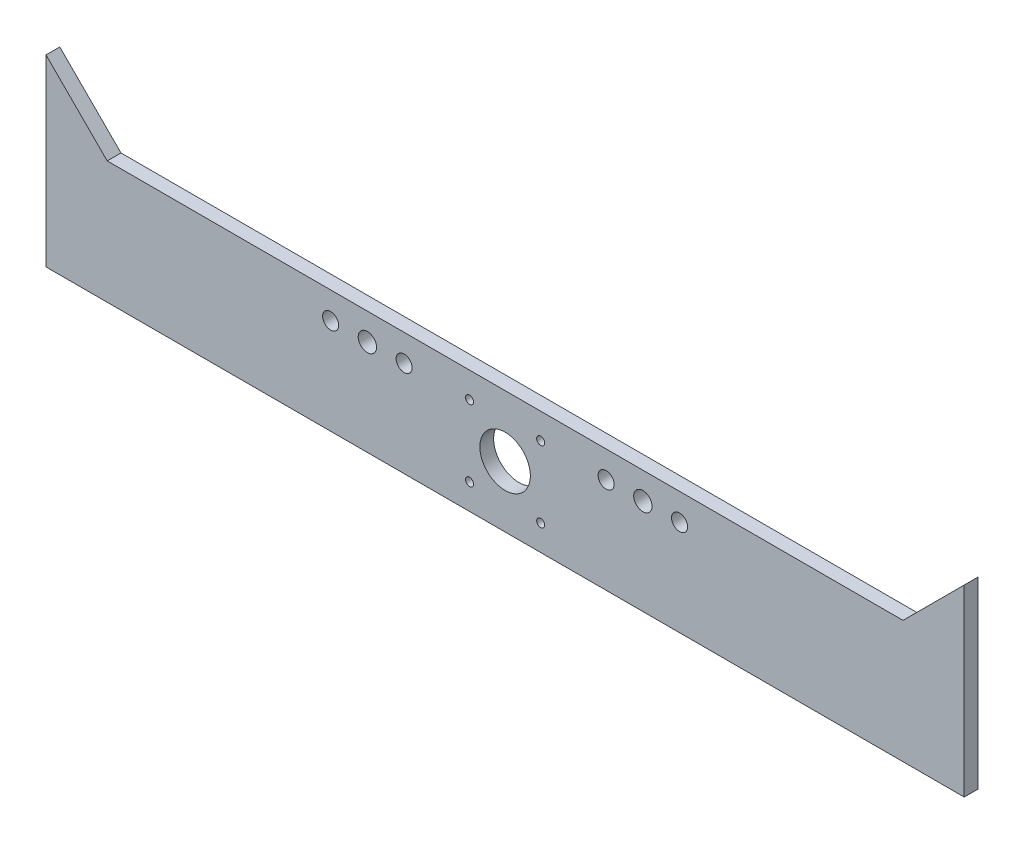
ISO-10303-21;
HEADER;
FILE_DESCRIPTION(('STEP AP214'),'2;1');
FILE_NAME('part.step','',(''),(''),'','','');
FILE_SCHEMA(('AUTOMOTIVE_DESIGN { 1 0 10303 214 1 1 1 1 }'));
ENDSEC;
DATA;
#1=APPLICATION_CONTEXT('core data for automotive mechanical design processes');
#2=APPLICATION_PROTOCOL_DEFINITION('international standard','automotive_design',2000,#1);
#3=PRODUCT_CONTEXT('',#1,'mechanical');
#4=PRODUCT('Part','Part','',(#3));
#5=PRODUCT_RELATED_PRODUCT_CATEGORY('part','',(#4));
#6=PRODUCT_DEFINITION_FORMATION('','',#4);
#7=PRODUCT_DEFINITION_CONTEXT('part definition',#1,'design');
#8=PRODUCT_DEFINITION('design','',#6,#7);
#9=PRODUCT_DEFINITION_SHAPE('','',#8);
#10=(LENGTH_UNIT() NAMED_UNIT(*) SI_UNIT(.MILLI.,.METRE.));
#11=(NAMED_UNIT(*) PLANE_ANGLE_UNIT() SI_UNIT($,.RADIAN.));
#12=(NAMED_UNIT(*) SI_UNIT($,.STERADIAN.) SOLID_ANGLE_UNIT());
#13=UNCERTAINTY_MEASURE_WITH_UNIT(LENGTH_MEASURE(1.E-05),#10,'distance_accuracy_value','');
#14=(GEOMETRIC_REPRESENTATION_CONTEXT(3) GLOBAL_UNCERTAINTY_ASSIGNED_CONTEXT((#13)) GLOBAL_UNIT_ASSIGNED_CONTEXT((#10,
#11,#12)) REPRESENTATION_CONTEXT('',''));
#15=CARTESIAN_POINT('',(0.,0.,0.));
#16=DIRECTION('',(0.,0.,1.));
#17=DIRECTION('',(1.,0.,0.));
#18=AXIS2_PLACEMENT_3D('',#15,#16,#17);
#19=CARTESIAN_POINT('',(-200.,0.,6.));
#20=DIRECTION('',(1.,0.,0.));
#21=DIRECTION('',(0.,1.,0.));
#22=AXIS2_PLACEMENT_3D('',#19,#20,#21);
#23=PLANE('',#22);
#24=DIRECTION('',(0.,-1.,0.));
#25=VECTOR('',#24,1.);
#26=CARTESIAN_POINT('',(-200.,0.,0.));
#27=LINE('',#26,#25);
#28=CARTESIAN_POINT('',(-200.,80.,0.));
#29=VERTEX_POINT('',#28);
#30=CARTESIAN_POINT('',(-200.,0.,0.));
#31=VERTEX_POINT('',#30);
#32=EDGE_CURVE('E117',#29,#31,#27,.T.);
#33=ORIENTED_EDGE('',*,*,#32,.T.);
#34=DIRECTION('',(0.,0.,-1.));
#35=VECTOR('',#34,1.);
#36=CARTESIAN_POINT('',(-200.,0.,6.));
#37=LINE('',#36,#35);
#38=CARTESIAN_POINT('',(-200.,0.,6.));
#39=VERTEX_POINT('',#38);
#40=EDGE_CURVE('E11',#39,#31,#37,.T.);
#41=ORIENTED_EDGE('',*,*,#40,.F.);
#42=DIRECTION('',(0.,-1.,0.));
#43=VECTOR('',#42,1.);
#44=CARTESIAN_POINT('',(-200.,0.,6.));
#45=LINE('',#44,#43);
#46=CARTESIAN_POINT('',(-200.,80.,6.));
#47=VERTEX_POINT('',#46);
#48=EDGE_CURVE('E128',#47,#39,#45,.T.);
#49=ORIENTED_EDGE('',*,*,#48,.F.);
#50=DIRECTION('',(0.,0.,-1.));
#51=VECTOR('',#50,1.);
#52=CARTESIAN_POINT('',(-200.,80.,6.));
#53=LINE('',#52,#51);
#54=EDGE_CURVE('E113',#47,#29,#53,.T.);
#55=ORIENTED_EDGE('',*,*,#54,.T.);
#56=EDGE_LOOP('',(#33,#41,#49,#55));
#57=FACE_BOUND('',#56,.T.);
#58=ADVANCED_FACE('F33',(#57),#23,.F.);
#59=CARTESIAN_POINT('',(-200.,0.,6.));
#60=DIRECTION('',(0.,1.,0.));
#61=DIRECTION('',(-1.,0.,0.));
#62=AXIS2_PLACEMENT_3D('',#59,#60,#61);
#63=PLANE('',#62);
#64=DIRECTION('',(1.,0.,0.));
#65=VECTOR('',#64,1.);
#66=CARTESIAN_POINT('',(-200.,0.,0.));
#67=LINE('',#66,#65);
#68=CARTESIAN_POINT('',(200.,0.,0.));
#69=VERTEX_POINT('',#68);
#70=EDGE_CURVE('E120',#31,#69,#67,.T.);
#71=ORIENTED_EDGE('',*,*,#70,.T.);
#72=DIRECTION('',(0.,0.,-1.));
#73=VECTOR('',#72,1.);
#74=CARTESIAN_POINT('',(200.,0.,6.));
#75=LINE('',#74,#73);
#76=CARTESIAN_POINT('',(200.,0.,6.));
#77=VERTEX_POINT('',#76);
#78=EDGE_CURVE('E41',#77,#69,#75,.T.);
#79=ORIENTED_EDGE('',*,*,#78,.F.);
#80=DIRECTION('',(1.,0.,0.));
#81=VECTOR('',#80,1.);
#82=CARTESIAN_POINT('',(-200.,0.,6.));
#83=LINE('',#82,#81);
#84=EDGE_CURVE('E86',#39,#77,#83,.T.);
#85=ORIENTED_EDGE('',*,*,#84,.F.);
#86=ORIENTED_EDGE('',*,*,#40,.T.);
#87=EDGE_LOOP('',(#71,#79,#85,#86));
#88=FACE_BOUND('',#87,.T.);
#89=ADVANCED_FACE('F153',(#88),#63,.F.);
#90=CARTESIAN_POINT('',(200.,0.,6.));
#91=DIRECTION('',(-1.,0.,0.));
#92=DIRECTION('',(0.,0.,1.));
#93=AXIS2_PLACEMENT_3D('',#90,#91,#92);
#94=PLANE('',#93);
#95=DIRECTION('',(0.,1.,0.));
#96=VECTOR('',#95,1.);
#97=CARTESIAN_POINT('',(200.,0.,0.));
#98=LINE('',#97,#96);
#99=CARTESIAN_POINT('',(200.,80.0000000000001,0.));
#100=VERTEX_POINT('',#99);
#101=EDGE_CURVE('E123',#69,#100,#98,.T.);
#102=ORIENTED_EDGE('',*,*,#101,.T.);
#103=DIRECTION('',(0.,0.,-1.));
#104=VECTOR('',#103,1.);
#105=CARTESIAN_POINT('',(200.,80.0000000000001,6.));
#106=LINE('',#105,#104);
#107=CARTESIAN_POINT('',(200.,80.0000000000001,6.));
#108=VERTEX_POINT('',#107);
#109=EDGE_CURVE('E108',#108,#100,#106,.T.);
#110=ORIENTED_EDGE('',*,*,#109,.F.);
#111=DIRECTION('',(0.,1.,0.));
#112=VECTOR('',#111,1.);
#113=CARTESIAN_POINT('',(200.,0.,6.));
#114=LINE('',#113,#112);
#115=EDGE_CURVE('E99',#77,#108,#114,.T.);
#116=ORIENTED_EDGE('',*,*,#115,.F.);
#117=ORIENTED_EDGE('',*,*,#78,.T.);
#118=EDGE_LOOP('',(#102,#110,#116,#117));
#119=FACE_BOUND('',#118,.T.);
#120=ADVANCED_FACE('F134',(#119),#94,.F.);
#121=CARTESIAN_POINT('',(200.,80.0000000000001,6.));
#122=DIRECTION('',(0.707106781186552,-0.707106781186543,0.));
#123=DIRECTION('',(0.707106781186543,0.707106781186552,0.));
#124=AXIS2_PLACEMENT_3D('',#121,#122,#123);
#125=PLANE('',#124);
#126=DIRECTION('',(-0.707106781186543,-0.707106781186552,0.));
#127=VECTOR('',#126,1.);
#128=CARTESIAN_POINT('',(200.,80.0000000000001,0.));
#129=LINE('',#128,#127);
#130=CARTESIAN_POINT('',(173.333333333334,53.3333333333334,0.));
#131=VERTEX_POINT('',#130);
#132=EDGE_CURVE('E107',#100,#131,#129,.T.);
#133=ORIENTED_EDGE('',*,*,#132,.T.);
#134=DIRECTION('',(0.,0.,-1.));
#135=VECTOR('',#134,1.);
#136=CARTESIAN_POINT('',(173.333333333334,53.3333333333334,6.));
#137=LINE('',#136,#135);
#138=CARTESIAN_POINT('',(173.333333333334,53.3333333333334,6.));
#139=VERTEX_POINT('',#138);
#140=EDGE_CURVE('E104',#139,#131,#137,.T.);
#141=ORIENTED_EDGE('',*,*,#140,.F.);
#142=DIRECTION('',(-0.707106781186543,-0.707106781186552,0.));
#143=VECTOR('',#142,1.);
#144=CARTESIAN_POINT('',(200.,80.0000000000001,6.));
#145=LINE('',#144,#143);
#146=EDGE_CURVE('E93',#108,#139,#145,.T.);
#147=ORIENTED_EDGE('',*,*,#146,.F.);
#148=ORIENTED_EDGE('',*,*,#109,.T.);
#149=EDGE_LOOP('',(#133,#141,#147,#148));
#150=FACE_BOUND('',#149,.T.);
#151=ADVANCED_FACE('F105',(#150),#125,.F.);
#152=CARTESIAN_POINT('',(-173.333333333334,53.333333333332,6.));
#153=DIRECTION('',(0.,-1.,0.));
#154=DIRECTION('',(1.,0.,0.));
#155=AXIS2_PLACEMENT_3D('',#152,#153,#154);
#156=PLANE('',#155);
#157=DIRECTION('',(-1.,0.,0.));
#158=VECTOR('',#157,1.);
#159=CARTESIAN_POINT('',(-173.333333333334,53.333333333332,0.));
#160=LINE('',#159,#158);
#161=CARTESIAN_POINT('',(-173.333333333334,53.333333333332,0.));
#162=VERTEX_POINT('',#161);
#163=EDGE_CURVE('E72',#131,#162,#160,.T.);
#164=ORIENTED_EDGE('',*,*,#163,.T.);
#165=DIRECTION('',(0.,0.,-1.));
#166=VECTOR('',#165,1.);
#167=CARTESIAN_POINT('',(-173.333333333334,53.333333333332,6.));
#168=LINE('',#167,#166);
#169=CARTESIAN_POINT('',(-173.333333333334,53.333333333332,6.));
#170=VERTEX_POINT('',#169);
#171=EDGE_CURVE('E109',#170,#162,#168,.T.);
#172=ORIENTED_EDGE('',*,*,#171,.F.);
#173=DIRECTION('',(-1.,0.,0.));
#174=VECTOR('',#173,1.);
#175=CARTESIAN_POINT('',(-173.333333333334,53.333333333332,6.));
#176=LINE('',#175,#174);
#177=EDGE_CURVE('E97',#139,#170,#176,.T.);
#178=ORIENTED_EDGE('',*,*,#177,.F.);
#179=ORIENTED_EDGE('',*,*,#140,.T.);
#180=EDGE_LOOP('',(#164,#172,#178,#179));
#181=FACE_BOUND('',#180,.T.);
#182=ADVANCED_FACE('F111',(#181),#156,.F.);
#183=CARTESIAN_POINT('',(-200.,80.,6.));
#184=DIRECTION('',(-0.707106781186573,-0.707106781186522,0.));
#185=DIRECTION('',(0.707106781186522,-0.707106781186573,0.));
#186=AXIS2_PLACEMENT_3D('',#183,#184,#185);
#187=PLANE('',#186);
#188=DIRECTION('',(-0.707106781186522,0.707106781186573,0.));
#189=VECTOR('',#188,1.);
#190=CARTESIAN_POINT('',(-200.,80.,0.));
#191=LINE('',#190,#189);
#192=EDGE_CURVE('E78',#162,#29,#191,.T.);
#193=ORIENTED_EDGE('',*,*,#192,.T.);
#194=ORIENTED_EDGE('',*,*,#54,.F.);
#195=DIRECTION('',(-0.707106781186522,0.707106781186573,0.));
#196=VECTOR('',#195,1.);
#197=CARTESIAN_POINT('',(-200.,80.,6.));
#198=LINE('',#197,#196);
#199=EDGE_CURVE('E49',#170,#47,#198,.T.);
#200=ORIENTED_EDGE('',*,*,#199,.F.);
#201=ORIENTED_EDGE('',*,*,#171,.T.);
#202=EDGE_LOOP('',(#193,#194,#200,#201));
#203=FACE_BOUND('',#202,.T.);
#204=ADVANCED_FACE('F141',(#203),#187,.F.);
#205=CARTESIAN_POINT('',(0.,0.,6.));
#206=DIRECTION('',(0.,0.,-1.));
#207=DIRECTION('',(-1.,0.,0.));
#208=AXIS2_PLACEMENT_3D('',#205,#206,#207);
#209=PLANE('',#208);
#210=CARTESIAN_POINT('',(-60.0000000000003,41.6649999999996,6.));
#211=DIRECTION('',(0.,0.,1.));
#212=DIRECTION('',(-1.,0.,0.));
#213=AXIS2_PLACEMENT_3D('',#210,#211,#212);
#214=CIRCLE('',#213,3.99999999999999);
#215=CARTESIAN_POINT('',(-64.0000000000003,41.6649999999996,6.));
#216=VERTEX_POINT('',#215);
#217=EDGE_CURVE('E309',#216,#216,#214,.T.);
#218=ORIENTED_EDGE('',*,*,#217,.F.);
#219=EDGE_LOOP('',(#218));
#220=FACE_BOUND('',#219,.T.);
#221=CARTESIAN_POINT('',(-76.0000000000003,41.6649999999996,6.));
#222=DIRECTION('',(0.,0.,1.));
#223=DIRECTION('',(-1.,0.,0.));
#224=AXIS2_PLACEMENT_3D('',#221,#222,#223);
#225=CIRCLE('',#224,3.50000000000001);
#226=CARTESIAN_POINT('',(-79.5000000000003,41.6649999999996,6.));
#227=VERTEX_POINT('',#226);
#228=EDGE_CURVE('E311',#227,#227,#225,.T.);
#229=ORIENTED_EDGE('',*,*,#228,.F.);
#230=EDGE_LOOP('',(#229));
#231=FACE_BOUND('',#230,.T.);
#232=CARTESIAN_POINT('',(15.5,42.165,6.));
#233=DIRECTION('',(0.,0.,1.));
#234=DIRECTION('',(1.,0.,0.));
#235=AXIS2_PLACEMENT_3D('',#232,#233,#234);
#236=CIRCLE('',#235,1.75);
#237=CARTESIAN_POINT('',(17.25,42.165,6.));
#238=VERTEX_POINT('',#237);
#239=EDGE_CURVE('E325',#238,#238,#236,.T.);
#240=ORIENTED_EDGE('',*,*,#239,.F.);
#241=EDGE_LOOP('',(#240));
#242=FACE_BOUND('',#241,.T.);
#243=CARTESIAN_POINT('',(-15.5000000000003,42.165,6.));
#244=DIRECTION('',(0.,0.,1.));
#245=DIRECTION('',(-1.,0.,0.));
#246=AXIS2_PLACEMENT_3D('',#243,#244,#245);
#247=CIRCLE('',#246,1.75);
#248=CARTESIAN_POINT('',(-17.2500000000003,42.165,6.));
#249=VERTEX_POINT('',#248);
#250=EDGE_CURVE('E338',#249,#249,#247,.T.);
#251=ORIENTED_EDGE('',*,*,#250,.F.);
#252=EDGE_LOOP('',(#251));
#253=FACE_BOUND('',#252,.T.);
#254=CARTESIAN_POINT('',(-15.5000000000003,11.165,6.));
#255=DIRECTION('',(0.,0.,1.));
#256=DIRECTION('',(1.,0.,0.));
#257=AXIS2_PLACEMENT_3D('',#254,#255,#256);
#258=CIRCLE('',#257,1.75);
#259=CARTESIAN_POINT('',(-13.7500000000003,11.165,6.));
#260=VERTEX_POINT('',#259);
#261=EDGE_CURVE('E344',#260,#260,#258,.T.);
#262=ORIENTED_EDGE('',*,*,#261,.F.);
#263=EDGE_LOOP('',(#262));
#264=FACE_BOUND('',#263,.T.);
#265=CARTESIAN_POINT('',(15.5,11.165,6.));
#266=DIRECTION('',(0.,0.,1.));
#267=DIRECTION('',(-1.,0.,0.));
#268=AXIS2_PLACEMENT_3D('',#265,#266,#267);
#269=CIRCLE('',#268,1.75);
#270=CARTESIAN_POINT('',(13.75,11.165,6.));
#271=VERTEX_POINT('',#270);
#272=EDGE_CURVE('E350',#271,#271,#269,.T.);
#273=ORIENTED_EDGE('',*,*,#272,.F.);
#274=EDGE_LOOP('',(#273));
#275=FACE_BOUND('',#274,.T.);
#276=CARTESIAN_POINT('',(60.,41.6650000000001,6.));
#277=DIRECTION('',(0.,0.,1.));
#278=DIRECTION('',(1.,0.,0.));
#279=AXIS2_PLACEMENT_3D('',#276,#277,#278);
#280=CIRCLE('',#279,4.00000000000001);
#281=CARTESIAN_POINT('',(64.,41.6650000000001,6.));
#282=VERTEX_POINT('',#281);
#283=EDGE_CURVE('E372',#282,#282,#280,.T.);
#284=ORIENTED_EDGE('',*,*,#283,.F.);
#285=EDGE_LOOP('',(#284));
#286=FACE_BOUND('',#285,.T.);
#287=CARTESIAN_POINT('',(76.0000000000001,41.665,6.));
#288=DIRECTION('',(0.,0.,1.));
#289=DIRECTION('',(1.,0.,0.));
#290=AXIS2_PLACEMENT_3D('',#287,#288,#289);
#291=CIRCLE('',#290,3.50000000000001);
#292=CARTESIAN_POINT('',(79.5000000000001,41.665,6.));
#293=VERTEX_POINT('',#292);
#294=EDGE_CURVE('E376',#293,#293,#291,.T.);
#295=ORIENTED_EDGE('',*,*,#294,.F.);
#296=EDGE_LOOP('',(#295));
#297=FACE_BOUND('',#296,.T.);
#298=CARTESIAN_POINT('',(44.,41.665,6.));
#299=DIRECTION('',(0.,0.,1.));
#300=DIRECTION('',(1.,0.,0.));
#301=AXIS2_PLACEMENT_3D('',#298,#299,#300);
#302=CIRCLE('',#301,3.5);
#303=CARTESIAN_POINT('',(47.5000000000001,41.665,6.));
#304=VERTEX_POINT('',#303);
#305=EDGE_CURVE('E380',#304,#304,#302,.T.);
#306=ORIENTED_EDGE('',*,*,#305,.F.);
#307=EDGE_LOOP('',(#306));
#308=FACE_BOUND('',#307,.T.);
#309=CARTESIAN_POINT('',(-44.0000000000003,41.6649999999996,6.));
#310=DIRECTION('',(0.,0.,1.));
#311=DIRECTION('',(-1.,0.,0.));
#312=AXIS2_PLACEMENT_3D('',#309,#310,#311);
#313=CIRCLE('',#312,3.50000000000001);
#314=CARTESIAN_POINT('',(-47.5000000000004,41.6649999999996,6.));
#315=VERTEX_POINT('',#314);
#316=EDGE_CURVE('E333',#315,#315,#313,.T.);
#317=ORIENTED_EDGE('',*,*,#316,.F.);
#318=EDGE_LOOP('',(#317));
#319=FACE_BOUND('',#318,.T.);
#320=CARTESIAN_POINT('',(0.,26.6649999999999,6.));
#321=DIRECTION('',(0.,0.,1.));
#322=DIRECTION('',(1.,0.,0.));
#323=AXIS2_PLACEMENT_3D('',#320,#321,#322);
#324=CIRCLE('',#323,11.);
#325=CARTESIAN_POINT('',(11.,26.6649999999999,6.));
#326=VERTEX_POINT('',#325);
#327=EDGE_CURVE('E317',#326,#326,#324,.T.);
#328=ORIENTED_EDGE('',*,*,#327,.F.);
#329=EDGE_LOOP('',(#328));
#330=FACE_BOUND('',#329,.T.);
#331=ORIENTED_EDGE('',*,*,#48,.T.);
#332=ORIENTED_EDGE('',*,*,#84,.T.);
#333=ORIENTED_EDGE('',*,*,#115,.T.);
#334=ORIENTED_EDGE('',*,*,#146,.T.);
#335=ORIENTED_EDGE('',*,*,#177,.T.);
#336=ORIENTED_EDGE('',*,*,#199,.T.);
#337=EDGE_LOOP('',(#331,#332,#333,#334,#335,#336));
#338=FACE_BOUND('',#337,.T.);
#339=ADVANCED_FACE('F95',(#220,#231,#242,#253,#264,#275,#286,#297,#308,#319,#330,#338),#209,.F.);
#340=CARTESIAN_POINT('',(0.,0.,0.));
#341=DIRECTION('',(0.,0.,-1.));
#342=DIRECTION('',(-1.,0.,0.));
#343=AXIS2_PLACEMENT_3D('',#340,#341,#342);
#344=PLANE('',#343);
#345=CARTESIAN_POINT('',(-60.0000000000003,41.6649999999996,0.));
#346=DIRECTION('',(0.,0.,1.));
#347=DIRECTION('',(-1.,0.,0.));
#348=AXIS2_PLACEMENT_3D('',#345,#346,#347);
#349=CIRCLE('',#348,3.99999999999999);
#350=CARTESIAN_POINT('',(-64.0000000000003,41.6649999999996,0.));
#351=VERTEX_POINT('',#350);
#352=EDGE_CURVE('E306',#351,#351,#349,.T.);
#353=ORIENTED_EDGE('',*,*,#352,.T.);
#354=EDGE_LOOP('',(#353));
#355=FACE_BOUND('',#354,.T.);
#356=CARTESIAN_POINT('',(-76.0000000000003,41.6649999999996,0.));
#357=DIRECTION('',(0.,0.,1.));
#358=DIRECTION('',(-1.,0.,0.));
#359=AXIS2_PLACEMENT_3D('',#356,#357,#358);
#360=CIRCLE('',#359,3.50000000000001);
#361=CARTESIAN_POINT('',(-79.5000000000003,41.6649999999996,0.));
#362=VERTEX_POINT('',#361);
#363=EDGE_CURVE('E354',#362,#362,#360,.T.);
#364=ORIENTED_EDGE('',*,*,#363,.T.);
#365=EDGE_LOOP('',(#364));
#366=FACE_BOUND('',#365,.T.);
#367=CARTESIAN_POINT('',(15.5,42.165,0.));
#368=DIRECTION('',(0.,0.,1.));
#369=DIRECTION('',(1.,0.,0.));
#370=AXIS2_PLACEMENT_3D('',#367,#368,#369);
#371=CIRCLE('',#370,1.75);
#372=CARTESIAN_POINT('',(17.25,42.165,0.));
#373=VERTEX_POINT('',#372);
#374=EDGE_CURVE('E320',#373,#373,#371,.T.);
#375=ORIENTED_EDGE('',*,*,#374,.T.);
#376=EDGE_LOOP('',(#375));
#377=FACE_BOUND('',#376,.T.);
#378=CARTESIAN_POINT('',(-15.5000000000003,42.165,0.));
#379=DIRECTION('',(0.,0.,1.));
#380=DIRECTION('',(-1.,0.,0.));
#381=AXIS2_PLACEMENT_3D('',#378,#379,#380);
#382=CIRCLE('',#381,1.75);
#383=CARTESIAN_POINT('',(-17.2500000000003,42.165,0.));
#384=VERTEX_POINT('',#383);
#385=EDGE_CURVE('E330',#384,#384,#382,.T.);
#386=ORIENTED_EDGE('',*,*,#385,.T.);
#387=EDGE_LOOP('',(#386));
#388=FACE_BOUND('',#387,.T.);
#389=CARTESIAN_POINT('',(-15.5000000000003,11.165,0.));
#390=DIRECTION('',(0.,0.,1.));
#391=DIRECTION('',(1.,0.,0.));
#392=AXIS2_PLACEMENT_3D('',#389,#390,#391);
#393=CIRCLE('',#392,1.75);
#394=CARTESIAN_POINT('',(-13.7500000000003,11.165,0.));
#395=VERTEX_POINT('',#394);
#396=EDGE_CURVE('E341',#395,#395,#393,.T.);
#397=ORIENTED_EDGE('',*,*,#396,.T.);
#398=EDGE_LOOP('',(#397));
#399=FACE_BOUND('',#398,.T.);
#400=CARTESIAN_POINT('',(15.5,11.165,0.));
#401=DIRECTION('',(0.,0.,1.));
#402=DIRECTION('',(-1.,0.,0.));
#403=AXIS2_PLACEMENT_3D('',#400,#401,#402);
#404=CIRCLE('',#403,1.75);
#405=CARTESIAN_POINT('',(13.75,11.165,0.));
#406=VERTEX_POINT('',#405);
#407=EDGE_CURVE('E347',#406,#406,#404,.T.);
#408=ORIENTED_EDGE('',*,*,#407,.T.);
#409=EDGE_LOOP('',(#408));
#410=FACE_BOUND('',#409,.T.);
#411=CARTESIAN_POINT('',(60.,41.6650000000001,0.));
#412=DIRECTION('',(0.,0.,1.));
#413=DIRECTION('',(1.,0.,0.));
#414=AXIS2_PLACEMENT_3D('',#411,#412,#413);
#415=CIRCLE('',#414,4.00000000000001);
#416=CARTESIAN_POINT('',(64.,41.6650000000001,0.));
#417=VERTEX_POINT('',#416);
#418=EDGE_CURVE('E353',#417,#417,#415,.T.);
#419=ORIENTED_EDGE('',*,*,#418,.T.);
#420=EDGE_LOOP('',(#419));
#421=FACE_BOUND('',#420,.T.);
#422=CARTESIAN_POINT('',(76.0000000000001,41.665,0.));
#423=DIRECTION('',(0.,0.,1.));
#424=DIRECTION('',(1.,0.,0.));
#425=AXIS2_PLACEMENT_3D('',#422,#423,#424);
#426=CIRCLE('',#425,3.50000000000001);
#427=CARTESIAN_POINT('',(79.5000000000001,41.665,0.));
#428=VERTEX_POINT('',#427);
#429=EDGE_CURVE('E395',#428,#428,#426,.T.);
#430=ORIENTED_EDGE('',*,*,#429,.T.);
#431=EDGE_LOOP('',(#430));
#432=FACE_BOUND('',#431,.T.);
#433=CARTESIAN_POINT('',(44.,41.665,0.));
#434=DIRECTION('',(0.,0.,1.));
#435=DIRECTION('',(1.,0.,0.));
#436=AXIS2_PLACEMENT_3D('',#433,#434,#435);
#437=CIRCLE('',#436,3.5);
#438=CARTESIAN_POINT('',(47.5000000000001,41.665,0.));
#439=VERTEX_POINT('',#438);
#440=EDGE_CURVE('E389',#439,#439,#437,.T.);
#441=ORIENTED_EDGE('',*,*,#440,.T.);
#442=EDGE_LOOP('',(#441));
#443=FACE_BOUND('',#442,.T.);
#444=CARTESIAN_POINT('',(-44.0000000000003,41.6649999999996,0.));
#445=DIRECTION('',(0.,0.,1.));
#446=DIRECTION('',(-1.,0.,0.));
#447=AXIS2_PLACEMENT_3D('',#444,#445,#446);
#448=CIRCLE('',#447,3.50000000000001);
#449=CARTESIAN_POINT('',(-47.5000000000004,41.6649999999996,0.));
#450=VERTEX_POINT('',#449);
#451=EDGE_CURVE('E385',#450,#450,#448,.T.);
#452=ORIENTED_EDGE('',*,*,#451,.T.);
#453=EDGE_LOOP('',(#452));
#454=FACE_BOUND('',#453,.T.);
#455=CARTESIAN_POINT('',(0.,26.6649999999999,0.));
#456=DIRECTION('',(0.,0.,1.));
#457=DIRECTION('',(1.,0.,0.));
#458=AXIS2_PLACEMENT_3D('',#455,#456,#457);
#459=CIRCLE('',#458,11.);
#460=CARTESIAN_POINT('',(11.,26.6649999999999,0.));
#461=VERTEX_POINT('',#460);
#462=EDGE_CURVE('E121',#461,#461,#459,.T.);
#463=ORIENTED_EDGE('',*,*,#462,.T.);
#464=EDGE_LOOP('',(#463));
#465=FACE_BOUND('',#464,.T.);
#466=ORIENTED_EDGE('',*,*,#32,.F.);
#467=ORIENTED_EDGE('',*,*,#192,.F.);
#468=ORIENTED_EDGE('',*,*,#163,.F.);
#469=ORIENTED_EDGE('',*,*,#132,.F.);
#470=ORIENTED_EDGE('',*,*,#101,.F.);
#471=ORIENTED_EDGE('',*,*,#70,.F.);
#472=EDGE_LOOP('',(#466,#467,#468,#469,#470,#471));
#473=FACE_BOUND('',#472,.T.);
#474=ADVANCED_FACE('F137',(#355,#366,#377,#388,#399,#410,#421,#432,#443,#454,#465,#473),#344,.T.);
#475=CARTESIAN_POINT('',(0.,26.6649999999999,0.));
#476=DIRECTION('',(0.,0.,1.));
#477=DIRECTION('',(1.,0.,0.));
#478=AXIS2_PLACEMENT_3D('',#475,#476,#477);
#479=CYLINDRICAL_SURFACE('',#478,11.);
#480=ORIENTED_EDGE('',*,*,#462,.F.);
#481=EDGE_LOOP('',(#480));
#482=FACE_BOUND('',#481,.T.);
#483=ORIENTED_EDGE('',*,*,#327,.T.);
#484=EDGE_LOOP('',(#483));
#485=FACE_BOUND('',#484,.T.);
#486=ADVANCED_FACE('F190',(#482,#485),#479,.F.);
#487=CARTESIAN_POINT('',(-44.0000000000003,41.6649999999996,0.));
#488=DIRECTION('',(0.,0.,1.));
#489=DIRECTION('',(1.,0.,0.));
#490=AXIS2_PLACEMENT_3D('',#487,#488,#489);
#491=CYLINDRICAL_SURFACE('',#490,3.50000000000001);
#492=ORIENTED_EDGE('',*,*,#451,.F.);
#493=EDGE_LOOP('',(#492));
#494=FACE_BOUND('',#493,.T.);
#495=ORIENTED_EDGE('',*,*,#316,.T.);
#496=EDGE_LOOP('',(#495));
#497=FACE_BOUND('',#496,.T.);
#498=ADVANCED_FACE('F199',(#494,#497),#491,.F.);
#499=CARTESIAN_POINT('',(44.,41.665,0.));
#500=DIRECTION('',(0.,0.,1.));
#501=DIRECTION('',(1.,0.,0.));
#502=AXIS2_PLACEMENT_3D('',#499,#500,#501);
#503=CYLINDRICAL_SURFACE('',#502,3.5);
#504=ORIENTED_EDGE('',*,*,#440,.F.);
#505=EDGE_LOOP('',(#504));
#506=FACE_BOUND('',#505,.T.);
#507=ORIENTED_EDGE('',*,*,#305,.T.);
#508=EDGE_LOOP('',(#507));
#509=FACE_BOUND('',#508,.T.);
#510=ADVANCED_FACE('F209',(#506,#509),#503,.F.);
#511=CARTESIAN_POINT('',(76.0000000000001,41.665,0.));
#512=DIRECTION('',(0.,0.,1.));
#513=DIRECTION('',(1.,0.,0.));
#514=AXIS2_PLACEMENT_3D('',#511,#512,#513);
#515=CYLINDRICAL_SURFACE('',#514,3.50000000000001);
#516=ORIENTED_EDGE('',*,*,#429,.F.);
#517=EDGE_LOOP('',(#516));
#518=FACE_BOUND('',#517,.T.);
#519=ORIENTED_EDGE('',*,*,#294,.T.);
#520=EDGE_LOOP('',(#519));
#521=FACE_BOUND('',#520,.T.);
#522=ADVANCED_FACE('F219',(#518,#521),#515,.F.);
#523=CARTESIAN_POINT('',(60.,41.6650000000001,0.));
#524=DIRECTION('',(0.,0.,1.));
#525=DIRECTION('',(1.,0.,0.));
#526=AXIS2_PLACEMENT_3D('',#523,#524,#525);
#527=CYLINDRICAL_SURFACE('',#526,4.00000000000001);
#528=ORIENTED_EDGE('',*,*,#418,.F.);
#529=EDGE_LOOP('',(#528));
#530=FACE_BOUND('',#529,.T.);
#531=ORIENTED_EDGE('',*,*,#283,.T.);
#532=EDGE_LOOP('',(#531));
#533=FACE_BOUND('',#532,.T.);
#534=ADVANCED_FACE('F229',(#530,#533),#527,.F.);
#535=CARTESIAN_POINT('',(15.5,11.165,0.));
#536=DIRECTION('',(0.,0.,1.));
#537=DIRECTION('',(1.,0.,0.));
#538=AXIS2_PLACEMENT_3D('',#535,#536,#537);
#539=CYLINDRICAL_SURFACE('',#538,1.75);
#540=ORIENTED_EDGE('',*,*,#407,.F.);
#541=EDGE_LOOP('',(#540));
#542=FACE_BOUND('',#541,.T.);
#543=ORIENTED_EDGE('',*,*,#272,.T.);
#544=EDGE_LOOP('',(#543));
#545=FACE_BOUND('',#544,.T.);
#546=ADVANCED_FACE('F239',(#542,#545),#539,.F.);
#547=CARTESIAN_POINT('',(-15.5000000000003,11.165,0.));
#548=DIRECTION('',(0.,0.,1.));
#549=DIRECTION('',(1.,0.,0.));
#550=AXIS2_PLACEMENT_3D('',#547,#548,#549);
#551=CYLINDRICAL_SURFACE('',#550,1.75);
#552=ORIENTED_EDGE('',*,*,#396,.F.);
#553=EDGE_LOOP('',(#552));
#554=FACE_BOUND('',#553,.T.);
#555=ORIENTED_EDGE('',*,*,#261,.T.);
#556=EDGE_LOOP('',(#555));
#557=FACE_BOUND('',#556,.T.);
#558=ADVANCED_FACE('F249',(#554,#557),#551,.F.);
#559=CARTESIAN_POINT('',(-15.5000000000003,42.165,0.));
#560=DIRECTION('',(0.,0.,1.));
#561=DIRECTION('',(1.,0.,0.));
#562=AXIS2_PLACEMENT_3D('',#559,#560,#561);
#563=CYLINDRICAL_SURFACE('',#562,1.75);
#564=ORIENTED_EDGE('',*,*,#385,.F.);
#565=EDGE_LOOP('',(#564));
#566=FACE_BOUND('',#565,.T.);
#567=ORIENTED_EDGE('',*,*,#250,.T.);
#568=EDGE_LOOP('',(#567));
#569=FACE_BOUND('',#568,.T.);
#570=ADVANCED_FACE('F259',(#566,#569),#563,.F.);
#571=CARTESIAN_POINT('',(15.5,42.165,0.));
#572=DIRECTION('',(0.,0.,1.));
#573=DIRECTION('',(1.,0.,0.));
#574=AXIS2_PLACEMENT_3D('',#571,#572,#573);
#575=CYLINDRICAL_SURFACE('',#574,1.75);
#576=ORIENTED_EDGE('',*,*,#374,.F.);
#577=EDGE_LOOP('',(#576));
#578=FACE_BOUND('',#577,.T.);
#579=ORIENTED_EDGE('',*,*,#239,.T.);
#580=EDGE_LOOP('',(#579));
#581=FACE_BOUND('',#580,.T.);
#582=ADVANCED_FACE('F269',(#578,#581),#575,.F.);
#583=CARTESIAN_POINT('',(-76.0000000000003,41.6649999999996,0.));
#584=DIRECTION('',(0.,0.,1.));
#585=DIRECTION('',(1.,0.,0.));
#586=AXIS2_PLACEMENT_3D('',#583,#584,#585);
#587=CYLINDRICAL_SURFACE('',#586,3.50000000000001);
#588=ORIENTED_EDGE('',*,*,#363,.F.);
#589=EDGE_LOOP('',(#588));
#590=FACE_BOUND('',#589,.T.);
#591=ORIENTED_EDGE('',*,*,#228,.T.);
#592=EDGE_LOOP('',(#591));
#593=FACE_BOUND('',#592,.T.);
#594=ADVANCED_FACE('F279',(#590,#593),#587,.F.);
#595=CARTESIAN_POINT('',(-60.0000000000003,41.6649999999996,0.));
#596=DIRECTION('',(0.,0.,1.));
#597=DIRECTION('',(1.,0.,0.));
#598=AXIS2_PLACEMENT_3D('',#595,#596,#597);
#599=CYLINDRICAL_SURFACE('',#598,3.99999999999999);
#600=ORIENTED_EDGE('',*,*,#352,.F.);
#601=EDGE_LOOP('',(#600));
#602=FACE_BOUND('',#601,.T.);
#603=ORIENTED_EDGE('',*,*,#217,.T.);
#604=EDGE_LOOP('',(#603));
#605=FACE_BOUND('',#604,.T.);
#606=ADVANCED_FACE('F289',(#602,#605),#599,.F.);
#607=CLOSED_SHELL('',(#58,#89,#120,#151,#182,#204,#339,#474,#486,#498,#510,#522,#534,#546,#558,
#570,#582,#594,#606));
#608=MANIFOLD_SOLID_BREP('B2',#607);
#609=ADVANCED_BREP_SHAPE_REPRESENTATION('',(#18,#608),#14);
#610=SHAPE_DEFINITION_REPRESENTATION(#9,#609);
ENDSEC;
END-ISO-10303-21;
